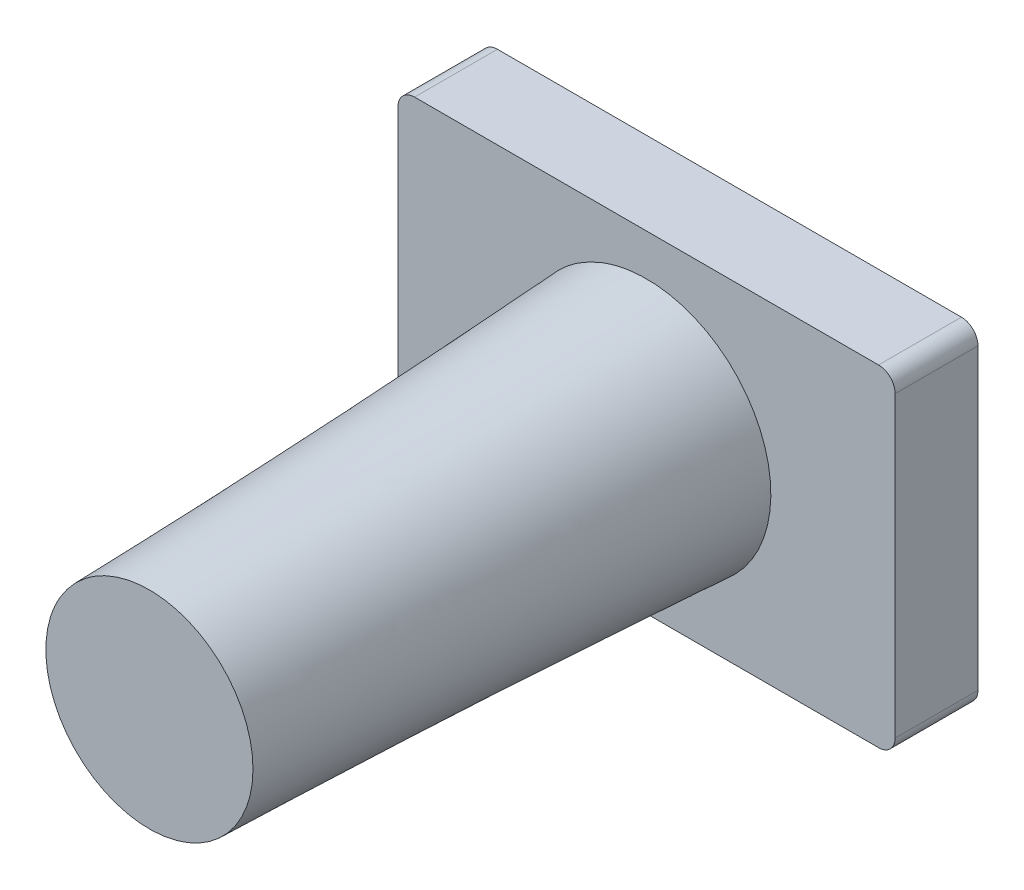
ISO-10303-21;
HEADER;
FILE_DESCRIPTION(('STEP AP214'),'2;1');
FILE_NAME('part.step','',(''),(''),'','','');
FILE_SCHEMA(('AUTOMOTIVE_DESIGN { 1 0 10303 214 1 1 1 1 }'));
ENDSEC;
DATA;
#1=APPLICATION_CONTEXT('core data for automotive mechanical design processes');
#2=APPLICATION_PROTOCOL_DEFINITION('international standard','automotive_design',2000,#1);
#3=PRODUCT_CONTEXT('',#1,'mechanical');
#4=PRODUCT('Part','Part','',(#3));
#5=PRODUCT_RELATED_PRODUCT_CATEGORY('part','',(#4));
#6=PRODUCT_DEFINITION_FORMATION('','',#4);
#7=PRODUCT_DEFINITION_CONTEXT('part definition',#1,'design');
#8=PRODUCT_DEFINITION('design','',#6,#7);
#9=PRODUCT_DEFINITION_SHAPE('','',#8);
#10=(LENGTH_UNIT() NAMED_UNIT(*) SI_UNIT(.MILLI.,.METRE.));
#11=(NAMED_UNIT(*) PLANE_ANGLE_UNIT() SI_UNIT($,.RADIAN.));
#12=(NAMED_UNIT(*) SI_UNIT($,.STERADIAN.) SOLID_ANGLE_UNIT());
#13=UNCERTAINTY_MEASURE_WITH_UNIT(LENGTH_MEASURE(1.E-05),#10,'distance_accuracy_value','');
#14=(GEOMETRIC_REPRESENTATION_CONTEXT(3) GLOBAL_UNCERTAINTY_ASSIGNED_CONTEXT((#13)) GLOBAL_UNIT_ASSIGNED_CONTEXT((#10,
#11,#12)) REPRESENTATION_CONTEXT('',''));
#15=CARTESIAN_POINT('',(0.,0.,0.));
#16=DIRECTION('',(0.,0.,1.));
#17=DIRECTION('',(1.,0.,0.));
#18=AXIS2_PLACEMENT_3D('',#15,#16,#17);
#19=CARTESIAN_POINT('',(-280.,-180.,99.9999999999994));
#20=DIRECTION('',(0.,0.,1.));
#21=DIRECTION('',(0.,-1.,0.));
#22=AXIS2_PLACEMENT_3D('',#19,#20,#21);
#23=PLANE('',#22);
#24=CARTESIAN_POINT('',(-280.,-180.,99.9999999999994));
#25=DIRECTION('',(0.,0.,1.));
#26=DIRECTION('',(0.,-1.,0.));
#27=AXIS2_PLACEMENT_3D('',#24,#25,#26);
#28=CIRCLE('',#27,20.);
#29=CARTESIAN_POINT('',(-300.,-180.,99.9999999999994));
#30=VERTEX_POINT('',#29);
#31=CARTESIAN_POINT('',(-280.,-200.,99.9999999999993));
#32=VERTEX_POINT('',#31);
#33=EDGE_CURVE('E153',#30,#32,#28,.T.);
#34=ORIENTED_EDGE('',*,*,#33,.T.);
#35=DIRECTION('',(1.,0.,0.));
#36=VECTOR('',#35,1.);
#37=CARTESIAN_POINT('',(-280.,-200.,99.9999999999993));
#38=LINE('',#37,#36);
#39=CARTESIAN_POINT('',(280.,-200.,99.9999999999993));
#40=VERTEX_POINT('',#39);
#41=EDGE_CURVE('E101',#32,#40,#38,.T.);
#42=ORIENTED_EDGE('',*,*,#41,.T.);
#43=CARTESIAN_POINT('',(280.,-180.,99.9999999999994));
#44=DIRECTION('',(0.,0.,1.));
#45=DIRECTION('',(0.,-1.,0.));
#46=AXIS2_PLACEMENT_3D('',#43,#44,#45);
#47=CIRCLE('',#46,20.);
#48=CARTESIAN_POINT('',(300.,-180.,99.9999999999994));
#49=VERTEX_POINT('',#48);
#50=EDGE_CURVE('E168',#40,#49,#47,.T.);
#51=ORIENTED_EDGE('',*,*,#50,.T.);
#52=DIRECTION('',(0.,1.,0.));
#53=VECTOR('',#52,1.);
#54=CARTESIAN_POINT('',(300.,180.,100.000000000001));
#55=LINE('',#54,#53);
#56=CARTESIAN_POINT('',(300.,180.,100.000000000001));
#57=VERTEX_POINT('',#56);
#58=EDGE_CURVE('E180',#49,#57,#55,.T.);
#59=ORIENTED_EDGE('',*,*,#58,.T.);
#60=CARTESIAN_POINT('',(280.,180.,100.000000000001));
#61=DIRECTION('',(0.,0.,1.));
#62=DIRECTION('',(0.,1.,0.));
#63=AXIS2_PLACEMENT_3D('',#60,#61,#62);
#64=CIRCLE('',#63,20.);
#65=CARTESIAN_POINT('',(280.,200.,100.000000000001));
#66=VERTEX_POINT('',#65);
#67=EDGE_CURVE('E120',#57,#66,#64,.T.);
#68=ORIENTED_EDGE('',*,*,#67,.T.);
#69=DIRECTION('',(-1.,0.,0.));
#70=VECTOR('',#69,1.);
#71=CARTESIAN_POINT('',(-280.,200.,100.000000000001));
#72=LINE('',#71,#70);
#73=CARTESIAN_POINT('',(-280.,200.,100.000000000001));
#74=VERTEX_POINT('',#73);
#75=EDGE_CURVE('E114',#66,#74,#72,.T.);
#76=ORIENTED_EDGE('',*,*,#75,.T.);
#77=CARTESIAN_POINT('',(-280.,180.,100.000000000001));
#78=DIRECTION('',(0.,0.,1.));
#79=DIRECTION('',(0.,-1.,0.));
#80=AXIS2_PLACEMENT_3D('',#77,#78,#79);
#81=CIRCLE('',#80,20.);
#82=CARTESIAN_POINT('',(-300.,180.,100.000000000001));
#83=VERTEX_POINT('',#82);
#84=EDGE_CURVE('E118',#74,#83,#81,.T.);
#85=ORIENTED_EDGE('',*,*,#84,.T.);
#86=DIRECTION('',(0.,-1.,0.));
#87=VECTOR('',#86,1.);
#88=CARTESIAN_POINT('',(-300.,180.,100.000000000001));
#89=LINE('',#88,#87);
#90=EDGE_CURVE('E58',#83,#30,#89,.T.);
#91=ORIENTED_EDGE('',*,*,#90,.T.);
#92=EDGE_LOOP('',(#34,#42,#51,#59,#68,#76,#85,#91));
#93=FACE_BOUND('',#92,.T.);
#94=CARTESIAN_POINT('',(0.,-3.49148133884313E-13,100.));
#95=DIRECTION('',(0.,0.,1.));
#96=DIRECTION('',(0.,-1.,0.));
#97=AXIS2_PLACEMENT_3D('',#94,#95,#96);
#98=CIRCLE('',#97,150.);
#99=CARTESIAN_POINT('',(67.7624586946668,-133.82170672822,99.9999999999995));
#100=VERTEX_POINT('',#99);
#101=EDGE_CURVE('E142',#100,#100,#98,.T.);
#102=ORIENTED_EDGE('',*,*,#101,.F.);
#103=EDGE_LOOP('',(#102));
#104=FACE_BOUND('',#103,.T.);
#105=ADVANCED_FACE('F41',(#93,#104),#23,.T.);
#106=CARTESIAN_POINT('',(-280.,-180.,99.9999999999994));
#107=DIRECTION('',(0.,0.,-1.));
#108=DIRECTION('',(0.,1.,0.));
#109=AXIS2_PLACEMENT_3D('',#106,#107,#108);
#110=CYLINDRICAL_SURFACE('',#109,20.);
#111=CARTESIAN_POINT('',(-280.,-180.,-6.28466640991764E-13));
#112=DIRECTION('',(0.,0.,1.));
#113=DIRECTION('',(0.,-1.,0.));
#114=AXIS2_PLACEMENT_3D('',#111,#112,#113);
#115=CIRCLE('',#114,20.);
#116=CARTESIAN_POINT('',(-300.,-180.,-6.28466640991764E-13));
#117=VERTEX_POINT('',#116);
#118=CARTESIAN_POINT('',(-280.,-200.,-6.98296267768627E-13));
#119=VERTEX_POINT('',#118);
#120=EDGE_CURVE('E138',#117,#119,#115,.T.);
#121=ORIENTED_EDGE('',*,*,#120,.T.);
#122=DIRECTION('',(0.,0.,-1.));
#123=VECTOR('',#122,1.);
#124=CARTESIAN_POINT('',(-280.,-200.,99.9999999999993));
#125=LINE('',#124,#123);
#126=EDGE_CURVE('E12',#32,#119,#125,.T.);
#127=ORIENTED_EDGE('',*,*,#126,.F.);
#128=ORIENTED_EDGE('',*,*,#33,.F.);
#129=DIRECTION('',(0.,0.,-1.));
#130=VECTOR('',#129,1.);
#131=CARTESIAN_POINT('',(-300.,-180.,99.9999999999994));
#132=LINE('',#131,#130);
#133=EDGE_CURVE('E134',#30,#117,#132,.T.);
#134=ORIENTED_EDGE('',*,*,#133,.T.);
#135=EDGE_LOOP('',(#121,#127,#128,#134));
#136=FACE_BOUND('',#135,.T.);
#137=ADVANCED_FACE('F43',(#136),#110,.T.);
#138=CARTESIAN_POINT('',(-280.,-200.,99.9999999999993));
#139=DIRECTION('',(0.,1.,0.));
#140=DIRECTION('',(-1.,0.,0.));
#141=AXIS2_PLACEMENT_3D('',#138,#139,#140);
#142=PLANE('',#141);
#143=DIRECTION('',(1.,0.,0.));
#144=VECTOR('',#143,1.);
#145=CARTESIAN_POINT('',(-280.,-200.,-6.98296267768627E-13));
#146=LINE('',#145,#144);
#147=CARTESIAN_POINT('',(280.,-200.,-6.98296267768627E-13));
#148=VERTEX_POINT('',#147);
#149=EDGE_CURVE('E141',#119,#148,#146,.T.);
#150=ORIENTED_EDGE('',*,*,#149,.T.);
#151=DIRECTION('',(0.,0.,-1.));
#152=VECTOR('',#151,1.);
#153=CARTESIAN_POINT('',(280.,-200.,99.9999999999993));
#154=LINE('',#153,#152);
#155=EDGE_CURVE('E50',#40,#148,#154,.T.);
#156=ORIENTED_EDGE('',*,*,#155,.F.);
#157=ORIENTED_EDGE('',*,*,#41,.F.);
#158=ORIENTED_EDGE('',*,*,#126,.T.);
#159=EDGE_LOOP('',(#150,#156,#157,#158));
#160=FACE_BOUND('',#159,.T.);
#161=ADVANCED_FACE('F236',(#160),#142,.F.);
#162=CARTESIAN_POINT('',(280.,-180.,99.9999999999994));
#163=DIRECTION('',(0.,0.,-1.));
#164=DIRECTION('',(0.,1.,0.));
#165=AXIS2_PLACEMENT_3D('',#162,#163,#164);
#166=CYLINDRICAL_SURFACE('',#165,20.);
#167=CARTESIAN_POINT('',(280.,-180.,-6.28466640991764E-13));
#168=DIRECTION('',(0.,0.,1.));
#169=DIRECTION('',(0.,-1.,0.));
#170=AXIS2_PLACEMENT_3D('',#167,#168,#169);
#171=CIRCLE('',#170,20.);
#172=CARTESIAN_POINT('',(300.,-180.,-6.28466640991764E-13));
#173=VERTEX_POINT('',#172);
#174=EDGE_CURVE('E144',#148,#173,#171,.T.);
#175=ORIENTED_EDGE('',*,*,#174,.T.);
#176=DIRECTION('',(0.,0.,-1.));
#177=VECTOR('',#176,1.);
#178=CARTESIAN_POINT('',(300.,-180.,99.9999999999994));
#179=LINE('',#178,#177);
#180=EDGE_CURVE('E160',#49,#173,#179,.T.);
#181=ORIENTED_EDGE('',*,*,#180,.F.);
#182=ORIENTED_EDGE('',*,*,#50,.F.);
#183=ORIENTED_EDGE('',*,*,#155,.T.);
#184=EDGE_LOOP('',(#175,#181,#182,#183));
#185=FACE_BOUND('',#184,.T.);
#186=ADVANCED_FACE('F166',(#185),#166,.T.);
#187=CARTESIAN_POINT('',(300.,180.,100.000000000001));
#188=DIRECTION('',(-1.,0.,0.));
#189=DIRECTION('',(0.,-1.,0.));
#190=AXIS2_PLACEMENT_3D('',#187,#188,#189);
#191=PLANE('',#190);
#192=DIRECTION('',(0.,1.,0.));
#193=VECTOR('',#192,1.);
#194=CARTESIAN_POINT('',(300.,180.,6.28466640991764E-13));
#195=LINE('',#194,#193);
#196=CARTESIAN_POINT('',(300.,180.,6.28466640991764E-13));
#197=VERTEX_POINT('',#196);
#198=EDGE_CURVE('E146',#173,#197,#195,.T.);
#199=ORIENTED_EDGE('',*,*,#198,.T.);
#200=DIRECTION('',(0.,0.,-1.));
#201=VECTOR('',#200,1.);
#202=CARTESIAN_POINT('',(300.,180.,100.000000000001));
#203=LINE('',#202,#201);
#204=EDGE_CURVE('E157',#57,#197,#203,.T.);
#205=ORIENTED_EDGE('',*,*,#204,.F.);
#206=ORIENTED_EDGE('',*,*,#58,.F.);
#207=ORIENTED_EDGE('',*,*,#180,.T.);
#208=EDGE_LOOP('',(#199,#205,#206,#207));
#209=FACE_BOUND('',#208,.T.);
#210=ADVANCED_FACE('F176',(#209),#191,.F.);
#211=CARTESIAN_POINT('',(280.,180.,100.000000000001));
#212=DIRECTION('',(0.,0.,-1.));
#213=DIRECTION('',(0.,1.,0.));
#214=AXIS2_PLACEMENT_3D('',#211,#212,#213);
#215=CYLINDRICAL_SURFACE('',#214,20.);
#216=CARTESIAN_POINT('',(280.,180.,6.28466640991764E-13));
#217=DIRECTION('',(0.,0.,1.));
#218=DIRECTION('',(0.,1.,0.));
#219=AXIS2_PLACEMENT_3D('',#216,#217,#218);
#220=CIRCLE('',#219,20.);
#221=CARTESIAN_POINT('',(280.,200.,6.98296267768627E-13));
#222=VERTEX_POINT('',#221);
#223=EDGE_CURVE('E148',#197,#222,#220,.T.);
#224=ORIENTED_EDGE('',*,*,#223,.T.);
#225=DIRECTION('',(0.,0.,-1.));
#226=VECTOR('',#225,1.);
#227=CARTESIAN_POINT('',(280.,200.,100.000000000001));
#228=LINE('',#227,#226);
#229=EDGE_CURVE('E129',#66,#222,#228,.T.);
#230=ORIENTED_EDGE('',*,*,#229,.F.);
#231=ORIENTED_EDGE('',*,*,#67,.F.);
#232=ORIENTED_EDGE('',*,*,#204,.T.);
#233=EDGE_LOOP('',(#224,#230,#231,#232));
#234=FACE_BOUND('',#233,.T.);
#235=ADVANCED_FACE('F179',(#234),#215,.T.);
#236=CARTESIAN_POINT('',(-280.,200.,100.000000000001));
#237=DIRECTION('',(0.,-1.,0.));
#238=DIRECTION('',(1.,0.,0.));
#239=AXIS2_PLACEMENT_3D('',#236,#237,#238);
#240=PLANE('',#239);
#241=DIRECTION('',(-1.,0.,0.));
#242=VECTOR('',#241,1.);
#243=CARTESIAN_POINT('',(-280.,200.,6.98296267768627E-13));
#244=LINE('',#243,#242);
#245=CARTESIAN_POINT('',(-280.,200.,6.98296267768627E-13));
#246=VERTEX_POINT('',#245);
#247=EDGE_CURVE('E128',#222,#246,#244,.T.);
#248=ORIENTED_EDGE('',*,*,#247,.T.);
#249=DIRECTION('',(0.,0.,-1.));
#250=VECTOR('',#249,1.);
#251=CARTESIAN_POINT('',(-280.,200.,100.000000000001));
#252=LINE('',#251,#250);
#253=EDGE_CURVE('E125',#74,#246,#252,.T.);
#254=ORIENTED_EDGE('',*,*,#253,.F.);
#255=ORIENTED_EDGE('',*,*,#75,.F.);
#256=ORIENTED_EDGE('',*,*,#229,.T.);
#257=EDGE_LOOP('',(#248,#254,#255,#256));
#258=FACE_BOUND('',#257,.T.);
#259=ADVANCED_FACE('F126',(#258),#240,.F.);
#260=CARTESIAN_POINT('',(-280.,180.,100.000000000001));
#261=DIRECTION('',(0.,0.,-1.));
#262=DIRECTION('',(0.,1.,0.));
#263=AXIS2_PLACEMENT_3D('',#260,#261,#262);
#264=CYLINDRICAL_SURFACE('',#263,20.);
#265=CARTESIAN_POINT('',(-280.,180.,6.28466640991764E-13));
#266=DIRECTION('',(0.,0.,1.));
#267=DIRECTION('',(0.,-1.,0.));
#268=AXIS2_PLACEMENT_3D('',#265,#266,#267);
#269=CIRCLE('',#268,20.);
#270=CARTESIAN_POINT('',(-300.,180.,6.28466640991764E-13));
#271=VERTEX_POINT('',#270);
#272=EDGE_CURVE('E87',#246,#271,#269,.T.);
#273=ORIENTED_EDGE('',*,*,#272,.T.);
#274=DIRECTION('',(0.,0.,-1.));
#275=VECTOR('',#274,1.);
#276=CARTESIAN_POINT('',(-300.,180.,100.000000000001));
#277=LINE('',#276,#275);
#278=EDGE_CURVE('E130',#83,#271,#277,.T.);
#279=ORIENTED_EDGE('',*,*,#278,.F.);
#280=ORIENTED_EDGE('',*,*,#84,.F.);
#281=ORIENTED_EDGE('',*,*,#253,.T.);
#282=EDGE_LOOP('',(#273,#279,#280,#281));
#283=FACE_BOUND('',#282,.T.);
#284=ADVANCED_FACE('F132',(#283),#264,.T.);
#285=CARTESIAN_POINT('',(-300.,180.,100.000000000001));
#286=DIRECTION('',(1.,0.,0.));
#287=DIRECTION('',(0.,1.,0.));
#288=AXIS2_PLACEMENT_3D('',#285,#286,#287);
#289=PLANE('',#288);
#290=DIRECTION('',(0.,-1.,0.));
#291=VECTOR('',#290,1.);
#292=CARTESIAN_POINT('',(-300.,180.,6.28466640991764E-13));
#293=LINE('',#292,#291);
#294=EDGE_CURVE('E93',#271,#117,#293,.T.);
#295=ORIENTED_EDGE('',*,*,#294,.T.);
#296=ORIENTED_EDGE('',*,*,#133,.F.);
#297=ORIENTED_EDGE('',*,*,#90,.F.);
#298=ORIENTED_EDGE('',*,*,#278,.T.);
#299=EDGE_LOOP('',(#295,#296,#297,#298));
#300=FACE_BOUND('',#299,.T.);
#301=ADVANCED_FACE('F243',(#300),#289,.F.);
#302=CARTESIAN_POINT('',(-280.,-180.,-6.28466640991764E-13));
#303=DIRECTION('',(0.,0.,1.));
#304=DIRECTION('',(0.,-1.,0.));
#305=AXIS2_PLACEMENT_3D('',#302,#303,#304);
#306=PLANE('',#305);
#307=ORIENTED_EDGE('',*,*,#120,.F.);
#308=ORIENTED_EDGE('',*,*,#294,.F.);
#309=ORIENTED_EDGE('',*,*,#272,.F.);
#310=ORIENTED_EDGE('',*,*,#247,.F.);
#311=ORIENTED_EDGE('',*,*,#223,.F.);
#312=ORIENTED_EDGE('',*,*,#198,.F.);
#313=ORIENTED_EDGE('',*,*,#174,.F.);
#314=ORIENTED_EDGE('',*,*,#149,.F.);
#315=EDGE_LOOP('',(#307,#308,#309,#310,#311,#312,#313,#314));
#316=FACE_BOUND('',#315,.T.);
#317=ADVANCED_FACE('F172',(#316),#306,.F.);
#318=CARTESIAN_POINT('',(0.,-2.44403693719019E-12,700.));
#319=DIRECTION('',(0.,0.,1.));
#320=DIRECTION('',(0.,-1.,0.));
#321=AXIS2_PLACEMENT_3D('',#318,#319,#320);
#322=PLANE('',#321);
#323=CARTESIAN_POINT('',(0.,-2.44403693719019E-12,700.));
#324=DIRECTION('',(0.,0.,1.));
#325=DIRECTION('',(0.,-1.,0.));
#326=AXIS2_PLACEMENT_3D('',#323,#324,#325);
#327=CIRCLE('',#326,125.);
#328=CARTESIAN_POINT('',(94.538797531434,-81.7766211169851,700.));
#329=VERTEX_POINT('',#328);
#330=EDGE_CURVE('E188',#329,#329,#327,.T.);
#331=ORIENTED_EDGE('',*,*,#330,.T.);
#332=EDGE_LOOP('',(#331));
#333=FACE_BOUND('',#332,.T.);
#334=ADVANCED_FACE('F198',(#333),#322,.T.);
#335=CARTESIAN_POINT('',(94.538797531434,-81.7766211169851,700.));
#336=CARTESIAN_POINT('',(67.7624586946668,-133.82170672822,99.9999999999995));
#337=CARTESIAN_POINT('',(-69.0144447025313,-270.854216179853,699.999999999999));
#338=CARTESIAN_POINT('',(-199.880954761772,-269.346624117554,99.9999999999991));
#339=CARTESIAN_POINT('',(-258.092039765399,-107.300973945888,700.));
#340=CARTESIAN_POINT('',(-335.405872151106,-1.70321066111436,100.));
#341=CARTESIAN_POINT('',(-94.538797531434,81.7766211169802,700.));
#342=CARTESIAN_POINT('',(-67.7624586946667,133.821706728219,100.));
#343=CARTESIAN_POINT('',(69.0144447025313,270.854216179848,700.000000000001));
#344=CARTESIAN_POINT('',(199.880954761772,269.346624117553,100.000000000001));
#345=CARTESIAN_POINT('',(258.092039765399,107.300973945883,700.));
#346=CARTESIAN_POINT('',(335.405872151106,1.70321066111366,100.));
#347=CARTESIAN_POINT('',(94.538797531434,-81.7766211169851,700.));
#348=CARTESIAN_POINT('',(67.7624586946668,-133.82170672822,99.9999999999995));
#349=(BOUNDED_SURFACE() B_SPLINE_SURFACE(3,1,((#335,#336),(#337,#338),(#339,#340),(#341,#342),
(#343,#344),(#345,#346),(#347,#348)),.UNSPECIFIED.,.T.,.F.,.F.) B_SPLINE_SURFACE_WITH_KNOTS((4,
3,4),(2,2),(0.,0.5,1.),(0.,1.),
.UNSPECIFIED.) GEOMETRIC_REPRESENTATION_ITEM() RATIONAL_B_SPLINE_SURFACE(((1.,1.),
(0.333333333333333,0.333333333333333),(0.333333333333333,0.333333333333333),(1.,1.),
(0.333333333333333,0.333333333333333),(0.333333333333333,0.333333333333333),(1.,1.))) REPRESENTATION_ITEM('') SURFACE());
#350=CARTESIAN_POINT('',(94.538797531434,-81.7766211169851,700.));
#351=CARTESIAN_POINT('',(94.2598773352177,-82.3187574254354,693.75));
#352=CARTESIAN_POINT('',(93.9809571390013,-82.8608937338858,687.5));
#353=CARTESIAN_POINT('',(93.4231167465687,-83.9451663507865,675.));
#354=CARTESIAN_POINT('',(93.1441965503524,-84.4873026592369,668.75));
#355=CARTESIAN_POINT('',(92.5863561579197,-85.5715752761376,656.25));
#356=CARTESIAN_POINT('',(92.3074359617034,-86.113711584588,650.));
#357=CARTESIAN_POINT('',(91.7495955692707,-87.1979842014887,637.5));
#358=CARTESIAN_POINT('',(91.4706753730544,-87.7401205099391,631.25));
#359=CARTESIAN_POINT('',(90.9128349806218,-88.8243931268398,618.75));
#360=CARTESIAN_POINT('',(90.6339147844054,-89.3665294352901,612.5));
#361=CARTESIAN_POINT('',(90.0760743919728,-90.4508020521909,600.));
#362=CARTESIAN_POINT('',(89.7971541957565,-90.9929383606412,593.75));
#363=CARTESIAN_POINT('',(89.2393138033238,-92.077210977542,581.25));
#364=CARTESIAN_POINT('',(88.9603936071075,-92.6193472859923,575.));
#365=CARTESIAN_POINT('',(88.4025532146748,-93.703619902893,562.5));
#366=CARTESIAN_POINT('',(88.1236330184585,-94.2457562113434,556.25));
#367=CARTESIAN_POINT('',(87.5657926260259,-95.3300288282441,543.75));
#368=CARTESIAN_POINT('',(87.2868724298095,-95.8721651366945,537.5));
#369=CARTESIAN_POINT('',(86.7290320373769,-96.9564377535952,525.));
#370=CARTESIAN_POINT('',(86.4501118411606,-97.4985740620456,518.75));
#371=CARTESIAN_POINT('',(85.8922714487279,-98.5828466789463,506.25));
#372=CARTESIAN_POINT('',(85.6133512525116,-99.1249829873967,500.));
#373=CARTESIAN_POINT('',(85.0555108600789,-100.209255604297,487.5));
#374=CARTESIAN_POINT('',(84.7765906638626,-100.751391912748,481.25));
#375=CARTESIAN_POINT('',(84.21875027143,-101.835664529648,468.75));
#376=CARTESIAN_POINT('',(83.9398300752136,-102.377800838099,462.5));
#377=CARTESIAN_POINT('',(83.381989682781,-103.462073455,450.));
#378=CARTESIAN_POINT('',(83.1030694865647,-104.00420976345,443.75));
#379=CARTESIAN_POINT('',(82.545229094132,-105.088482380351,431.25));
#380=CARTESIAN_POINT('',(82.2663088979157,-105.630618688801,425.));
#381=CARTESIAN_POINT('',(81.7084685054831,-106.714891305702,412.5));
#382=CARTESIAN_POINT('',(81.4295483092667,-107.257027614152,406.25));
#383=CARTESIAN_POINT('',(80.8717079168341,-108.341300231053,393.75));
#384=CARTESIAN_POINT('',(80.5927877206177,-108.883436539503,387.5));
#385=CARTESIAN_POINT('',(80.0349473281851,-109.967709156404,375.));
#386=CARTESIAN_POINT('',(79.7560271319688,-110.509845464854,368.75));
#387=CARTESIAN_POINT('',(79.1981867395361,-111.594118081755,356.25));
#388=CARTESIAN_POINT('',(78.9192665433198,-112.136254390205,350.));
#389=CARTESIAN_POINT('',(78.3614261508872,-113.220527007106,337.5));
#390=CARTESIAN_POINT('',(78.0825059546708,-113.762663315556,331.25));
#391=CARTESIAN_POINT('',(77.5246655622382,-114.846935932457,318.75));
#392=CARTESIAN_POINT('',(77.2457453660218,-115.389072240908,312.5));
#393=CARTESIAN_POINT('',(76.6879049735892,-116.473344857808,300.));
#394=CARTESIAN_POINT('',(76.4089847773729,-117.015481166259,293.75));
#395=CARTESIAN_POINT('',(75.8511443849402,-118.099753783159,281.25));
#396=CARTESIAN_POINT('',(75.5722241887239,-118.64189009161,275.));
#397=CARTESIAN_POINT('',(75.0143837962913,-119.72616270851,262.5));
#398=CARTESIAN_POINT('',(74.7354636000749,-120.268299016961,256.25));
#399=CARTESIAN_POINT('',(74.1776232076423,-121.352571633862,243.75));
#400=CARTESIAN_POINT('',(73.898703011426,-121.894707942312,237.5));
#401=CARTESIAN_POINT('',(73.3408626189933,-122.978980559213,225.));
#402=CARTESIAN_POINT('',(73.061942422777,-123.521116867663,218.75));
#403=CARTESIAN_POINT('',(72.5041020303443,-124.605389484564,206.25));
#404=CARTESIAN_POINT('',(72.225181834128,-125.147525793014,200.));
#405=CARTESIAN_POINT('',(71.6673414416954,-126.231798409915,187.5));
#406=CARTESIAN_POINT('',(71.388421245479,-126.773934718365,181.25));
#407=CARTESIAN_POINT('',(70.8305808530464,-127.858207335266,168.75));
#408=CARTESIAN_POINT('',(70.5516606568301,-128.400343643716,162.5));
#409=CARTESIAN_POINT('',(69.9938202643974,-129.484616260617,150.));
#410=CARTESIAN_POINT('',(69.7149000681811,-130.026752569067,143.75));
#411=CARTESIAN_POINT('',(69.1570596757484,-131.111025185968,131.25));
#412=CARTESIAN_POINT('',(68.8781394795321,-131.653161494418,125.));
#413=CARTESIAN_POINT('',(68.3202990870995,-132.737434111319,112.5));
#414=CARTESIAN_POINT('',(68.0413788908831,-133.279570419769,106.25));
#415=CARTESIAN_POINT('',(67.7624586946668,-133.82170672822,99.9999999999995));
#416=B_SPLINE_CURVE_WITH_KNOTS('',3,(#350,#351,#352,#353,#354,#355,#356,#357,#358,#359,#360,
#361,#362,#363,#364,#365,#366,#367,#368,#369,#370,#371,#372,#373,#374,#375,#376,#377,#378,#379,
#380,#381,#382,#383,#384,#385,#386,#387,#388,#389,#390,#391,#392,#393,#394,#395,#396,#397,#398,
#399,#400,#401,#402,#403,#404,#405,#406,#407,#408,#409,#410,#411,#412,#413,#414,#415),
.UNSPECIFIED.,.F.,.F.,(4,2,2,2,2,2,2,2,2,2,2,2,2,2,2,2,2,2,2,2,2,2,2,2,2,2,2,2,2,2,2,2,4),(0.,
18.8389987598911,37.6779975197822,56.5169962796733,75.3559950395643,94.1949937994554,
113.033992559347,131.872991319238,150.711990079129,169.55098883902,188.389987598911,
207.228986358802,226.067985118693,244.906983878584,263.745982638475,282.584981398366,
301.423980158257,320.262978918149,339.10197767804,357.940976437931,376.779975197822,
395.618973957713,414.457972717604,433.296971477495,452.135970237386,470.974968997277,
489.813967757168,508.65296651706,527.491965276951,546.330964036842,565.169962796733,
584.008961556624,602.847960316515),.UNSPECIFIED.);
#417=EDGE_CURVE('BSEAM207',#329,#100,#416,.T.);
#418=ORIENTED_EDGE('',*,*,#330,.F.);
#419=ORIENTED_EDGE('',*,*,#101,.T.);
#420=ORIENTED_EDGE('',*,*,#417,.T.);
#421=ORIENTED_EDGE('',*,*,#417,.F.);
#422=EDGE_LOOP('',(#418,#420,#419,#421));
#423=FACE_BOUND('',#422,.T.);
#424=ADVANCED_FACE('F207',(#423),#349,.T.);
#425=CLOSED_SHELL('',(#105,#137,#161,#186,#210,#235,#259,#284,#301,#317,#334,#424));
#426=MANIFOLD_SOLID_BREP('B2',#425);
#427=ADVANCED_BREP_SHAPE_REPRESENTATION('',(#18,#426),#14);
#428=SHAPE_DEFINITION_REPRESENTATION(#9,#427);
ENDSEC;
END-ISO-10303-21;
